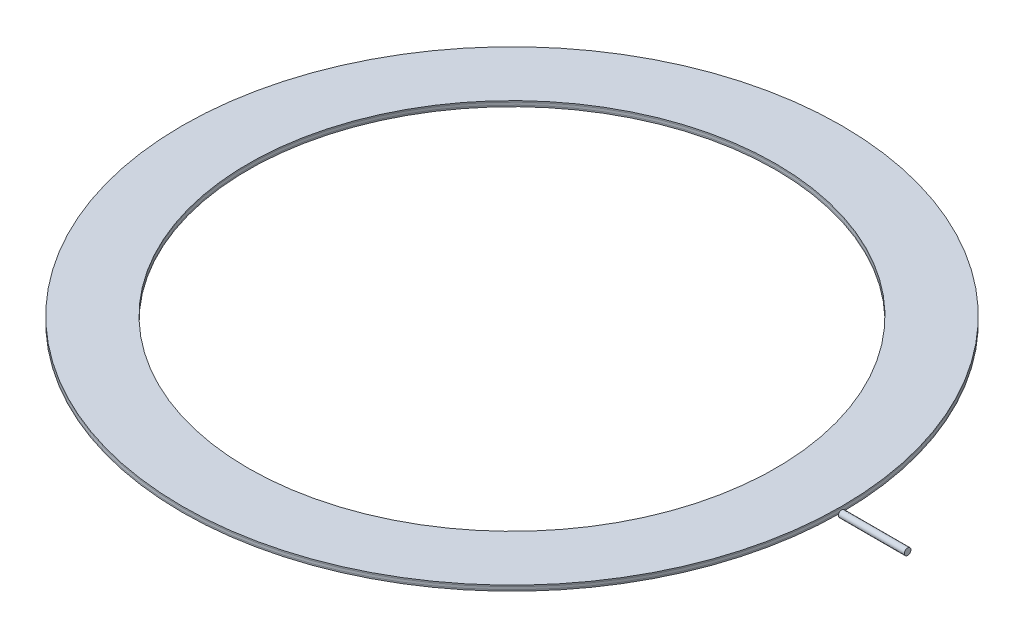
ISO-10303-21;
HEADER;
FILE_DESCRIPTION(('STEP AP214'),'2;1');
FILE_NAME('part.step','',(''),(''),'','','');
FILE_SCHEMA(('AUTOMOTIVE_DESIGN { 1 0 10303 214 1 1 1 1 }'));
ENDSEC;
DATA;
#1=APPLICATION_CONTEXT('core data for automotive mechanical design processes');
#2=APPLICATION_PROTOCOL_DEFINITION('international standard','automotive_design',2000,#1);
#3=PRODUCT_CONTEXT('',#1,'mechanical');
#4=PRODUCT('Part','Part','',(#3));
#5=PRODUCT_RELATED_PRODUCT_CATEGORY('part','',(#4));
#6=PRODUCT_DEFINITION_FORMATION('','',#4);
#7=PRODUCT_DEFINITION_CONTEXT('part definition',#1,'design');
#8=PRODUCT_DEFINITION('design','',#6,#7);
#9=PRODUCT_DEFINITION_SHAPE('','',#8);
#10=(LENGTH_UNIT() NAMED_UNIT(*) SI_UNIT(.MILLI.,.METRE.));
#11=(NAMED_UNIT(*) PLANE_ANGLE_UNIT() SI_UNIT($,.RADIAN.));
#12=(NAMED_UNIT(*) SI_UNIT($,.STERADIAN.) SOLID_ANGLE_UNIT());
#13=UNCERTAINTY_MEASURE_WITH_UNIT(LENGTH_MEASURE(1.E-05),#10,'distance_accuracy_value','');
#14=(GEOMETRIC_REPRESENTATION_CONTEXT(3) GLOBAL_UNCERTAINTY_ASSIGNED_CONTEXT((#13)) GLOBAL_UNIT_ASSIGNED_CONTEXT((#10,
#11,#12)) REPRESENTATION_CONTEXT('',''));
#15=CARTESIAN_POINT('',(0.,0.,0.));
#16=DIRECTION('',(0.,0.,1.));
#17=DIRECTION('',(1.,0.,0.));
#18=AXIS2_PLACEMENT_3D('',#15,#16,#17);
#19=CARTESIAN_POINT('',(0.,0.4,0.));
#20=DIRECTION('',(0.,1.,0.));
#21=DIRECTION('',(0.,0.,1.));
#22=AXIS2_PLACEMENT_3D('',#19,#20,#21);
#23=PLANE('',#22);
#24=CARTESIAN_POINT('',(0.,0.4,0.));
#25=DIRECTION('',(0.,1.,0.));
#26=DIRECTION('',(0.,0.,1.));
#27=AXIS2_PLACEMENT_3D('',#24,#25,#26);
#28=CIRCLE('',#27,25.);
#29=CARTESIAN_POINT('',(0.,0.4,25.));
#30=VERTEX_POINT('',#29);
#31=EDGE_CURVE('E12',#30,#30,#28,.T.);
#32=ORIENTED_EDGE('',*,*,#31,.T.);
#33=EDGE_LOOP('',(#32));
#34=FACE_BOUND('',#33,.T.);
#35=CARTESIAN_POINT('',(0.,0.4,0.));
#36=DIRECTION('',(0.,1.,0.));
#37=DIRECTION('',(0.,0.,1.));
#38=AXIS2_PLACEMENT_3D('',#35,#36,#37);
#39=CIRCLE('',#38,20.);
#40=CARTESIAN_POINT('',(0.,0.4,20.));
#41=VERTEX_POINT('',#40);
#42=EDGE_CURVE('E69',#41,#41,#39,.T.);
#43=ORIENTED_EDGE('',*,*,#42,.F.);
#44=EDGE_LOOP('',(#43));
#45=FACE_BOUND('',#44,.T.);
#46=ADVANCED_FACE('F58',(#34,#45),#23,.T.);
#47=CARTESIAN_POINT('',(0.,0.3,0.));
#48=DIRECTION('',(0.,1.,0.));
#49=DIRECTION('',(0.,0.,1.));
#50=AXIS2_PLACEMENT_3D('',#47,#48,#49);
#51=PLANE('',#50);
#52=CARTESIAN_POINT('',(0.,0.3,0.));
#53=DIRECTION('',(0.,1.,0.));
#54=DIRECTION('',(0.,0.,1.));
#55=AXIS2_PLACEMENT_3D('',#52,#53,#54);
#56=CIRCLE('',#55,25.);
#57=CARTESIAN_POINT('',(0.,0.3,25.));
#58=VERTEX_POINT('',#57);
#59=EDGE_CURVE('E62',#58,#58,#56,.T.);
#60=ORIENTED_EDGE('',*,*,#59,.F.);
#61=EDGE_LOOP('',(#60));
#62=FACE_BOUND('',#61,.T.);
#63=CARTESIAN_POINT('',(0.,0.3,0.));
#64=DIRECTION('',(0.,1.,0.));
#65=DIRECTION('',(0.,0.,1.));
#66=AXIS2_PLACEMENT_3D('',#63,#64,#65);
#67=CIRCLE('',#66,20.);
#68=CARTESIAN_POINT('',(0.,0.3,20.));
#69=VERTEX_POINT('',#68);
#70=EDGE_CURVE('E71',#69,#69,#67,.T.);
#71=ORIENTED_EDGE('',*,*,#70,.T.);
#72=EDGE_LOOP('',(#71));
#73=FACE_BOUND('',#72,.T.);
#74=ADVANCED_FACE('F81',(#62,#73),#51,.F.);
#75=CARTESIAN_POINT('',(0.,0.4,0.));
#76=DIRECTION('',(0.,-1.,0.));
#77=DIRECTION('',(0.,0.,-1.));
#78=AXIS2_PLACEMENT_3D('',#75,#76,#77);
#79=CYLINDRICAL_SURFACE('',#78,25.);
#80=ORIENTED_EDGE('',*,*,#31,.F.);
#81=EDGE_LOOP('',(#80));
#82=FACE_BOUND('',#81,.T.);
#83=ORIENTED_EDGE('',*,*,#59,.T.);
#84=EDGE_LOOP('',(#83));
#85=FACE_BOUND('',#84,.T.);
#86=ADVANCED_FACE('F60',(#82,#85),#79,.T.);
#87=CARTESIAN_POINT('',(0.,0.4,0.));
#88=DIRECTION('',(0.,-1.,0.));
#89=DIRECTION('',(0.,0.,-1.));
#90=AXIS2_PLACEMENT_3D('',#87,#88,#89);
#91=CYLINDRICAL_SURFACE('',#90,20.);
#92=ORIENTED_EDGE('',*,*,#42,.T.);
#93=EDGE_LOOP('',(#92));
#94=FACE_BOUND('',#93,.T.);
#95=ORIENTED_EDGE('',*,*,#70,.F.);
#96=EDGE_LOOP('',(#95));
#97=FACE_BOUND('',#96,.T.);
#98=ADVANCED_FACE('F77',(#94,#97),#91,.F.);
#99=CLOSED_SHELL('',(#46,#74,#86,#98));
#100=MANIFOLD_SOLID_BREP('B2',#99);
#101=CARTESIAN_POINT('',(0.,0.3,0.));
#102=DIRECTION('',(0.,1.,0.));
#103=DIRECTION('',(0.,0.,1.));
#104=AXIS2_PLACEMENT_3D('',#101,#102,#103);
#105=PLANE('',#104);
#106=CARTESIAN_POINT('',(0.,0.3,0.));
#107=DIRECTION('',(0.,1.,0.));
#108=DIRECTION('',(0.,0.,1.));
#109=AXIS2_PLACEMENT_3D('',#106,#107,#108);
#110=CIRCLE('',#109,25.);
#111=CARTESIAN_POINT('',(0.,0.3,25.));
#112=VERTEX_POINT('',#111);
#113=EDGE_CURVE('E57',#112,#112,#110,.T.);
#114=ORIENTED_EDGE('',*,*,#113,.T.);
#115=EDGE_LOOP('',(#114));
#116=FACE_BOUND('',#115,.T.);
#117=CARTESIAN_POINT('',(0.,0.3,0.));
#118=DIRECTION('',(0.,1.,0.));
#119=DIRECTION('',(0.,0.,1.));
#120=AXIS2_PLACEMENT_3D('',#117,#118,#119);
#121=CIRCLE('',#120,20.);
#122=CARTESIAN_POINT('',(0.,0.3,20.));
#123=VERTEX_POINT('',#122);
#124=EDGE_CURVE('E141',#123,#123,#121,.T.);
#125=ORIENTED_EDGE('',*,*,#124,.F.);
#126=EDGE_LOOP('',(#125));
#127=FACE_BOUND('',#126,.T.);
#128=ADVANCED_FACE('F128',(#116,#127),#105,.T.);
#129=CARTESIAN_POINT('',(0.,0.1,0.));
#130=DIRECTION('',(0.,1.,0.));
#131=DIRECTION('',(0.,0.,1.));
#132=AXIS2_PLACEMENT_3D('',#129,#130,#131);
#133=PLANE('',#132);
#134=CARTESIAN_POINT('',(0.,0.1,0.));
#135=DIRECTION('',(0.,1.,0.));
#136=DIRECTION('',(0.,0.,1.));
#137=AXIS2_PLACEMENT_3D('',#134,#135,#136);
#138=CIRCLE('',#137,25.);
#139=CARTESIAN_POINT('',(0.,0.1,25.));
#140=VERTEX_POINT('',#139);
#141=EDGE_CURVE('E132',#140,#140,#138,.T.);
#142=ORIENTED_EDGE('',*,*,#141,.F.);
#143=EDGE_LOOP('',(#142));
#144=FACE_BOUND('',#143,.T.);
#145=CARTESIAN_POINT('',(0.,0.1,0.));
#146=DIRECTION('',(0.,1.,0.));
#147=DIRECTION('',(0.,0.,1.));
#148=AXIS2_PLACEMENT_3D('',#145,#146,#147);
#149=CIRCLE('',#148,20.);
#150=CARTESIAN_POINT('',(0.,0.1,20.));
#151=VERTEX_POINT('',#150);
#152=EDGE_CURVE('E143',#151,#151,#149,.T.);
#153=ORIENTED_EDGE('',*,*,#152,.T.);
#154=EDGE_LOOP('',(#153));
#155=FACE_BOUND('',#154,.T.);
#156=ADVANCED_FACE('F155',(#144,#155),#133,.F.);
#157=CARTESIAN_POINT('',(0.,0.3,0.));
#158=DIRECTION('',(0.,-1.,0.));
#159=DIRECTION('',(0.,0.,-1.));
#160=AXIS2_PLACEMENT_3D('',#157,#158,#159);
#161=CYLINDRICAL_SURFACE('',#160,25.);
#162=ORIENTED_EDGE('',*,*,#113,.F.);
#163=EDGE_LOOP('',(#162));
#164=FACE_BOUND('',#163,.T.);
#165=ORIENTED_EDGE('',*,*,#141,.T.);
#166=EDGE_LOOP('',(#165));
#167=FACE_BOUND('',#166,.T.);
#168=ADVANCED_FACE('F130',(#164,#167),#161,.T.);
#169=CARTESIAN_POINT('',(0.,0.3,0.));
#170=DIRECTION('',(0.,-1.,0.));
#171=DIRECTION('',(0.,0.,-1.));
#172=AXIS2_PLACEMENT_3D('',#169,#170,#171);
#173=CYLINDRICAL_SURFACE('',#172,20.);
#174=ORIENTED_EDGE('',*,*,#124,.T.);
#175=EDGE_LOOP('',(#174));
#176=FACE_BOUND('',#175,.T.);
#177=ORIENTED_EDGE('',*,*,#152,.F.);
#178=EDGE_LOOP('',(#177));
#179=FACE_BOUND('',#178,.T.);
#180=ADVANCED_FACE('F151',(#176,#179),#173,.F.);
#181=CLOSED_SHELL('',(#128,#156,#168,#180));
#182=MANIFOLD_SOLID_BREP('B7',#181);
#183=CARTESIAN_POINT('',(22.5,-0.08,0.));
#184=DIRECTION('',(1.,0.,0.));
#185=DIRECTION('',(0.,1.,0.));
#186=AXIS2_PLACEMENT_3D('',#183,#184,#185);
#187=PLANE('',#186);
#188=CARTESIAN_POINT('',(22.5,-0.08,0.));
#189=DIRECTION('',(1.,0.,0.));
#190=DIRECTION('',(0.,1.,0.));
#191=AXIS2_PLACEMENT_3D('',#188,#189,#190);
#192=CIRCLE('',#191,0.08);
#193=CARTESIAN_POINT('',(22.5,0.,0.));
#194=VERTEX_POINT('',#193);
#195=EDGE_CURVE('E206',#194,#194,#192,.T.);
#196=ORIENTED_EDGE('',*,*,#195,.F.);
#197=EDGE_LOOP('',(#196));
#198=FACE_BOUND('',#197,.T.);
#199=ADVANCED_FACE('F200',(#198),#187,.F.);
#200=CARTESIAN_POINT('',(22.5,-0.08,0.));
#201=DIRECTION('',(1.,0.,0.));
#202=DIRECTION('',(0.,1.,0.));
#203=AXIS2_PLACEMENT_3D('',#200,#201,#202);
#204=CYLINDRICAL_SURFACE('',#203,0.08);
#205=CARTESIAN_POINT('',(25.,-0.08,0.));
#206=DIRECTION('',(1.,0.,0.));
#207=DIRECTION('',(0.,1.,0.));
#208=AXIS2_PLACEMENT_3D('',#205,#206,#207);
#209=CIRCLE('',#208,0.08);
#210=CARTESIAN_POINT('',(25.,0.,0.));
#211=VERTEX_POINT('',#210);
#212=EDGE_CURVE('E127',#211,#211,#209,.T.);
#213=ORIENTED_EDGE('',*,*,#212,.F.);
#214=EDGE_LOOP('',(#213));
#215=FACE_BOUND('',#214,.T.);
#216=ORIENTED_EDGE('',*,*,#195,.T.);
#217=EDGE_LOOP('',(#216));
#218=FACE_BOUND('',#217,.T.);
#219=ADVANCED_FACE('F225',(#215,#218),#204,.T.);
#220=CARTESIAN_POINT('',(25.,-0.08,0.));
#221=DIRECTION('',(1.,0.,0.));
#222=DIRECTION('',(0.,0.,-1.));
#223=AXIS2_PLACEMENT_3D('',#220,#221,#222);
#224=PLANE('',#223);
#225=ORIENTED_EDGE('',*,*,#212,.T.);
#226=EDGE_LOOP('',(#225));
#227=FACE_BOUND('',#226,.T.);
#228=CARTESIAN_POINT('',(25.,-0.08,0.));
#229=DIRECTION('',(1.,0.,0.));
#230=DIRECTION('',(0.,0.,-1.));
#231=AXIS2_PLACEMENT_3D('',#228,#229,#230);
#232=CIRCLE('',#231,0.25);
#233=CARTESIAN_POINT('',(25.,-0.08,-0.25));
#234=VERTEX_POINT('',#233);
#235=EDGE_CURVE('E214',#234,#234,#232,.T.);
#236=ORIENTED_EDGE('',*,*,#235,.F.);
#237=EDGE_LOOP('',(#236));
#238=FACE_BOUND('',#237,.T.);
#239=ADVANCED_FACE('F222',(#227,#238),#224,.F.);
#240=CARTESIAN_POINT('',(30.,-0.08,0.));
#241=DIRECTION('',(1.,0.,0.));
#242=DIRECTION('',(0.,0.,-1.));
#243=AXIS2_PLACEMENT_3D('',#240,#241,#242);
#244=PLANE('',#243);
#245=CARTESIAN_POINT('',(30.,-0.08,0.));
#246=DIRECTION('',(1.,0.,0.));
#247=DIRECTION('',(0.,0.,-1.));
#248=AXIS2_PLACEMENT_3D('',#245,#246,#247);
#249=CIRCLE('',#248,0.25);
#250=CARTESIAN_POINT('',(30.,-0.08,-0.25));
#251=VERTEX_POINT('',#250);
#252=EDGE_CURVE('E210',#251,#251,#249,.T.);
#253=ORIENTED_EDGE('',*,*,#252,.T.);
#254=EDGE_LOOP('',(#253));
#255=FACE_BOUND('',#254,.T.);
#256=ADVANCED_FACE('F224',(#255),#244,.T.);
#257=CARTESIAN_POINT('',(25.,-0.08,0.));
#258=DIRECTION('',(1.,0.,0.));
#259=DIRECTION('',(0.,0.,-1.));
#260=AXIS2_PLACEMENT_3D('',#257,#258,#259);
#261=CYLINDRICAL_SURFACE('',#260,0.25);
#262=ORIENTED_EDGE('',*,*,#252,.F.);
#263=EDGE_LOOP('',(#262));
#264=FACE_BOUND('',#263,.T.);
#265=ORIENTED_EDGE('',*,*,#235,.T.);
#266=EDGE_LOOP('',(#265));
#267=FACE_BOUND('',#266,.T.);
#268=ADVANCED_FACE('F220',(#264,#267),#261,.T.);
#269=CLOSED_SHELL('',(#199,#219,#239,#256,#268));
#270=MANIFOLD_SOLID_BREP('B52',#269);
#271=CARTESIAN_POINT('',(0.,0.1,0.));
#272=DIRECTION('',(0.,1.,0.));
#273=DIRECTION('',(0.,0.,1.));
#274=AXIS2_PLACEMENT_3D('',#271,#272,#273);
#275=PLANE('',#274);
#276=CARTESIAN_POINT('',(0.,0.1,0.));
#277=DIRECTION('',(0.,1.,0.));
#278=DIRECTION('',(0.,0.,1.));
#279=AXIS2_PLACEMENT_3D('',#276,#277,#278);
#280=CIRCLE('',#279,25.);
#281=CARTESIAN_POINT('',(0.,0.1,25.));
#282=VERTEX_POINT('',#281);
#283=EDGE_CURVE('E199',#282,#282,#280,.T.);
#284=ORIENTED_EDGE('',*,*,#283,.T.);
#285=EDGE_LOOP('',(#284));
#286=FACE_BOUND('',#285,.T.);
#287=CARTESIAN_POINT('',(0.,0.1,0.));
#288=DIRECTION('',(0.,1.,0.));
#289=DIRECTION('',(0.,0.,1.));
#290=AXIS2_PLACEMENT_3D('',#287,#288,#289);
#291=CIRCLE('',#290,20.);
#292=CARTESIAN_POINT('',(0.,0.1,20.));
#293=VERTEX_POINT('',#292);
#294=EDGE_CURVE('E281',#293,#293,#291,.T.);
#295=ORIENTED_EDGE('',*,*,#294,.F.);
#296=EDGE_LOOP('',(#295));
#297=FACE_BOUND('',#296,.T.);
#298=ADVANCED_FACE('F270',(#286,#297),#275,.T.);
#299=CARTESIAN_POINT('',(0.,0.,0.));
#300=DIRECTION('',(0.,1.,0.));
#301=DIRECTION('',(0.,0.,1.));
#302=AXIS2_PLACEMENT_3D('',#299,#300,#301);
#303=PLANE('',#302);
#304=CARTESIAN_POINT('',(0.,0.,0.));
#305=DIRECTION('',(0.,1.,0.));
#306=DIRECTION('',(0.,0.,1.));
#307=AXIS2_PLACEMENT_3D('',#304,#305,#306);
#308=CIRCLE('',#307,25.);
#309=CARTESIAN_POINT('',(0.,0.,25.));
#310=VERTEX_POINT('',#309);
#311=EDGE_CURVE('E274',#310,#310,#308,.T.);
#312=ORIENTED_EDGE('',*,*,#311,.F.);
#313=EDGE_LOOP('',(#312));
#314=FACE_BOUND('',#313,.T.);
#315=CARTESIAN_POINT('',(0.,0.,0.));
#316=DIRECTION('',(0.,1.,0.));
#317=DIRECTION('',(0.,0.,1.));
#318=AXIS2_PLACEMENT_3D('',#315,#316,#317);
#319=CIRCLE('',#318,20.);
#320=CARTESIAN_POINT('',(0.,0.,20.));
#321=VERTEX_POINT('',#320);
#322=EDGE_CURVE('E283',#321,#321,#319,.T.);
#323=ORIENTED_EDGE('',*,*,#322,.T.);
#324=EDGE_LOOP('',(#323));
#325=FACE_BOUND('',#324,.T.);
#326=ADVANCED_FACE('F293',(#314,#325),#303,.F.);
#327=CARTESIAN_POINT('',(0.,0.1,0.));
#328=DIRECTION('',(0.,-1.,0.));
#329=DIRECTION('',(0.,0.,-1.));
#330=AXIS2_PLACEMENT_3D('',#327,#328,#329);
#331=CYLINDRICAL_SURFACE('',#330,25.);
#332=ORIENTED_EDGE('',*,*,#311,.T.);
#333=EDGE_LOOP('',(#332));
#334=FACE_BOUND('',#333,.T.);
#335=ORIENTED_EDGE('',*,*,#283,.F.);
#336=EDGE_LOOP('',(#335));
#337=FACE_BOUND('',#336,.T.);
#338=ADVANCED_FACE('F272',(#334,#337),#331,.T.);
#339=CARTESIAN_POINT('',(0.,0.1,0.));
#340=DIRECTION('',(0.,-1.,0.));
#341=DIRECTION('',(0.,0.,-1.));
#342=AXIS2_PLACEMENT_3D('',#339,#340,#341);
#343=CYLINDRICAL_SURFACE('',#342,20.);
#344=ORIENTED_EDGE('',*,*,#294,.T.);
#345=EDGE_LOOP('',(#344));
#346=FACE_BOUND('',#345,.T.);
#347=ORIENTED_EDGE('',*,*,#322,.F.);
#348=EDGE_LOOP('',(#347));
#349=FACE_BOUND('',#348,.T.);
#350=ADVANCED_FACE('F289',(#346,#349),#343,.F.);
#351=CLOSED_SHELL('',(#298,#326,#338,#350));
#352=MANIFOLD_SOLID_BREP('B122',#351);
#353=ADVANCED_BREP_SHAPE_REPRESENTATION('',(#18,#100,#182,#270,#352),#14);
#354=SHAPE_DEFINITION_REPRESENTATION(#9,#353);
ENDSEC;
END-ISO-10303-21;
